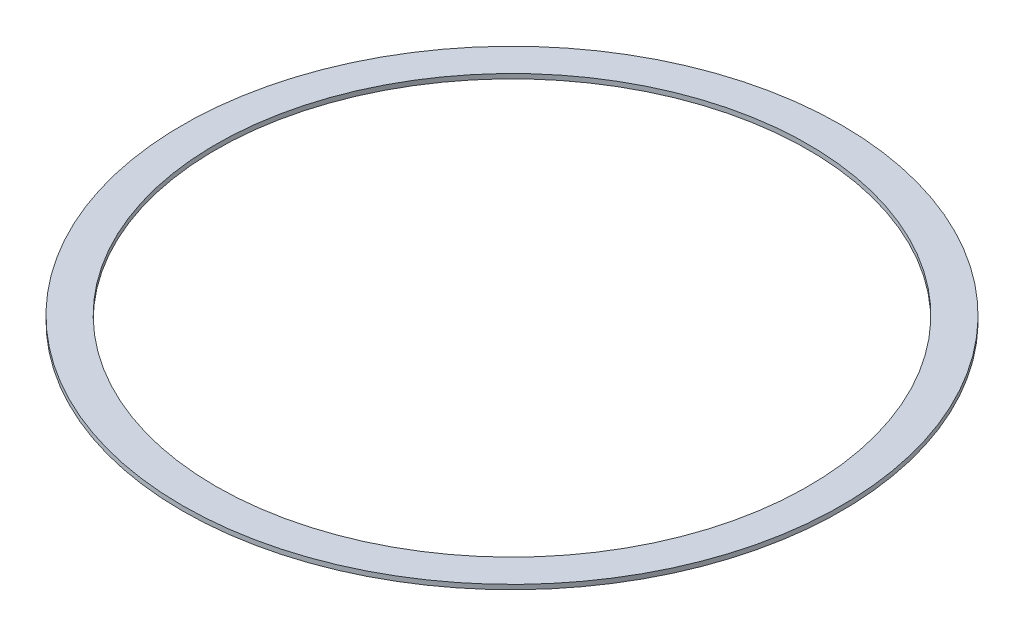
ISO-10303-21;
HEADER;
FILE_DESCRIPTION(('STEP AP214'),'2;1');
FILE_NAME('part.step','',(''),(''),'','','');
FILE_SCHEMA(('AUTOMOTIVE_DESIGN { 1 0 10303 214 1 1 1 1 }'));
ENDSEC;
DATA;
#1=APPLICATION_CONTEXT('core data for automotive mechanical design processes');
#2=APPLICATION_PROTOCOL_DEFINITION('international standard','automotive_design',2000,#1);
#3=PRODUCT_CONTEXT('',#1,'mechanical');
#4=PRODUCT('Part','Part','',(#3));
#5=PRODUCT_RELATED_PRODUCT_CATEGORY('part','',(#4));
#6=PRODUCT_DEFINITION_FORMATION('','',#4);
#7=PRODUCT_DEFINITION_CONTEXT('part definition',#1,'design');
#8=PRODUCT_DEFINITION('design','',#6,#7);
#9=PRODUCT_DEFINITION_SHAPE('','',#8);
#10=(LENGTH_UNIT() NAMED_UNIT(*) SI_UNIT(.MILLI.,.METRE.));
#11=(NAMED_UNIT(*) PLANE_ANGLE_UNIT() SI_UNIT($,.RADIAN.));
#12=(NAMED_UNIT(*) SI_UNIT($,.STERADIAN.) SOLID_ANGLE_UNIT());
#13=UNCERTAINTY_MEASURE_WITH_UNIT(LENGTH_MEASURE(1.E-05),#10,'distance_accuracy_value','');
#14=(GEOMETRIC_REPRESENTATION_CONTEXT(3) GLOBAL_UNCERTAINTY_ASSIGNED_CONTEXT((#13)) GLOBAL_UNIT_ASSIGNED_CONTEXT((#10,
#11,#12)) REPRESENTATION_CONTEXT('',''));
#15=CARTESIAN_POINT('',(0.,0.,0.));
#16=DIRECTION('',(0.,0.,1.));
#17=DIRECTION('',(1.,0.,0.));
#18=AXIS2_PLACEMENT_3D('',#15,#16,#17);
#19=CARTESIAN_POINT('',(0.,2.54,0.));
#20=DIRECTION('',(0.,1.,0.));
#21=DIRECTION('',(0.,0.,1.));
#22=AXIS2_PLACEMENT_3D('',#19,#20,#21);
#23=PLANE('',#22);
#24=CARTESIAN_POINT('',(0.,2.54,0.));
#25=DIRECTION('',(0.,1.,0.));
#26=DIRECTION('',(0.,0.,1.));
#27=AXIS2_PLACEMENT_3D('',#24,#25,#26);
#28=CIRCLE('',#27,180.5559);
#29=CARTESIAN_POINT('',(0.,2.54,180.5559));
#30=VERTEX_POINT('',#29);
#31=EDGE_CURVE('E10',#30,#30,#28,.T.);
#32=ORIENTED_EDGE('',*,*,#31,.T.);
#33=EDGE_LOOP('',(#32));
#34=FACE_BOUND('',#33,.T.);
#35=CARTESIAN_POINT('',(0.,2.54,0.));
#36=DIRECTION('',(0.,1.,0.));
#37=DIRECTION('',(0.,0.,1.));
#38=AXIS2_PLACEMENT_3D('',#35,#36,#37);
#39=CIRCLE('',#38,162.2679);
#40=CARTESIAN_POINT('',(0.,2.54,162.2679));
#41=VERTEX_POINT('',#40);
#42=EDGE_CURVE('E55',#41,#41,#39,.T.);
#43=ORIENTED_EDGE('',*,*,#42,.F.);
#44=EDGE_LOOP('',(#43));
#45=FACE_BOUND('',#44,.T.);
#46=ADVANCED_FACE('F42',(#34,#45),#23,.T.);
#47=CARTESIAN_POINT('',(0.,0.,0.));
#48=DIRECTION('',(0.,1.,0.));
#49=DIRECTION('',(0.,0.,1.));
#50=AXIS2_PLACEMENT_3D('',#47,#48,#49);
#51=PLANE('',#50);
#52=CARTESIAN_POINT('',(0.,0.,0.));
#53=DIRECTION('',(0.,1.,0.));
#54=DIRECTION('',(0.,0.,1.));
#55=AXIS2_PLACEMENT_3D('',#52,#53,#54);
#56=CIRCLE('',#55,180.5559);
#57=CARTESIAN_POINT('',(0.,0.,180.5559));
#58=VERTEX_POINT('',#57);
#59=EDGE_CURVE('E46',#58,#58,#56,.T.);
#60=ORIENTED_EDGE('',*,*,#59,.F.);
#61=EDGE_LOOP('',(#60));
#62=FACE_BOUND('',#61,.T.);
#63=CARTESIAN_POINT('',(0.,0.,0.));
#64=DIRECTION('',(0.,1.,0.));
#65=DIRECTION('',(0.,0.,1.));
#66=AXIS2_PLACEMENT_3D('',#63,#64,#65);
#67=CIRCLE('',#66,162.2679);
#68=CARTESIAN_POINT('',(0.,0.,162.2679));
#69=VERTEX_POINT('',#68);
#70=EDGE_CURVE('E57',#69,#69,#67,.T.);
#71=ORIENTED_EDGE('',*,*,#70,.T.);
#72=EDGE_LOOP('',(#71));
#73=FACE_BOUND('',#72,.T.);
#74=ADVANCED_FACE('F69',(#62,#73),#51,.F.);
#75=CARTESIAN_POINT('',(0.,2.54,0.));
#76=DIRECTION('',(0.,-1.,0.));
#77=DIRECTION('',(0.,0.,-1.));
#78=AXIS2_PLACEMENT_3D('',#75,#76,#77);
#79=CYLINDRICAL_SURFACE('',#78,180.5559);
#80=ORIENTED_EDGE('',*,*,#31,.F.);
#81=EDGE_LOOP('',(#80));
#82=FACE_BOUND('',#81,.T.);
#83=ORIENTED_EDGE('',*,*,#59,.T.);
#84=EDGE_LOOP('',(#83));
#85=FACE_BOUND('',#84,.T.);
#86=ADVANCED_FACE('F44',(#82,#85),#79,.T.);
#87=CARTESIAN_POINT('',(0.,2.54,0.));
#88=DIRECTION('',(0.,-1.,0.));
#89=DIRECTION('',(0.,0.,-1.));
#90=AXIS2_PLACEMENT_3D('',#87,#88,#89);
#91=CYLINDRICAL_SURFACE('',#90,162.2679);
#92=ORIENTED_EDGE('',*,*,#42,.T.);
#93=EDGE_LOOP('',(#92));
#94=FACE_BOUND('',#93,.T.);
#95=ORIENTED_EDGE('',*,*,#70,.F.);
#96=EDGE_LOOP('',(#95));
#97=FACE_BOUND('',#96,.T.);
#98=ADVANCED_FACE('F65',(#94,#97),#91,.F.);
#99=CLOSED_SHELL('',(#46,#74,#86,#98));
#100=MANIFOLD_SOLID_BREP('B2',#99);
#101=ADVANCED_BREP_SHAPE_REPRESENTATION('',(#18,#100),#14);
#102=SHAPE_DEFINITION_REPRESENTATION(#9,#101);
ENDSEC;
END-ISO-10303-21;
